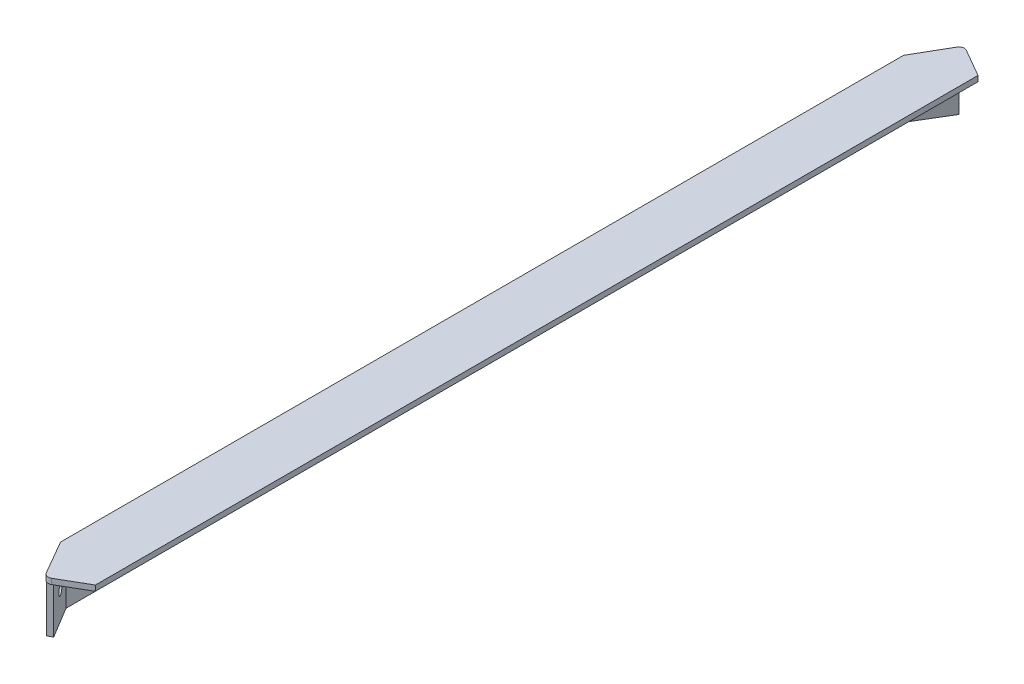
ISO-10303-21;
HEADER;
FILE_DESCRIPTION(('STEP AP214'),'2;1');
FILE_NAME('part.step','',(''),(''),'','','');
FILE_SCHEMA(('AUTOMOTIVE_DESIGN { 1 0 10303 214 1 1 1 1 }'));
ENDSEC;
DATA;
#1=APPLICATION_CONTEXT('core data for automotive mechanical design processes');
#2=APPLICATION_PROTOCOL_DEFINITION('international standard','automotive_design',2000,#1);
#3=PRODUCT_CONTEXT('',#1,'mechanical');
#4=PRODUCT('Part','Part','',(#3));
#5=PRODUCT_RELATED_PRODUCT_CATEGORY('part','',(#4));
#6=PRODUCT_DEFINITION_FORMATION('','',#4);
#7=PRODUCT_DEFINITION_CONTEXT('part definition',#1,'design');
#8=PRODUCT_DEFINITION('design','',#6,#7);
#9=PRODUCT_DEFINITION_SHAPE('','',#8);
#10=(LENGTH_UNIT() NAMED_UNIT(*) SI_UNIT(.MILLI.,.METRE.));
#11=(NAMED_UNIT(*) PLANE_ANGLE_UNIT() SI_UNIT($,.RADIAN.));
#12=(NAMED_UNIT(*) SI_UNIT($,.STERADIAN.) SOLID_ANGLE_UNIT());
#13=UNCERTAINTY_MEASURE_WITH_UNIT(LENGTH_MEASURE(1.E-05),#10,'distance_accuracy_value','');
#14=(GEOMETRIC_REPRESENTATION_CONTEXT(3) GLOBAL_UNCERTAINTY_ASSIGNED_CONTEXT((#13)) GLOBAL_UNIT_ASSIGNED_CONTEXT((#10,
#11,#12)) REPRESENTATION_CONTEXT('',''));
#15=CARTESIAN_POINT('',(0.,0.,0.));
#16=DIRECTION('',(0.,0.,1.));
#17=DIRECTION('',(1.,0.,0.));
#18=AXIS2_PLACEMENT_3D('',#15,#16,#17);
#19=CARTESIAN_POINT('',(7.,0.,540.));
#20=DIRECTION('',(0.,1.,0.));
#21=DIRECTION('',(-1.,0.,0.));
#22=AXIS2_PLACEMENT_3D('',#19,#20,#21);
#23=PLANE('',#22);
#24=DIRECTION('',(0.,0.,-1.));
#25=VECTOR('',#24,1.);
#26=CARTESIAN_POINT('',(0.,0.,540.));
#27=LINE('',#26,#25);
#28=CARTESIAN_POINT('',(0.,0.,540.));
#29=VERTEX_POINT('',#28);
#30=CARTESIAN_POINT('',(0.,0.,-540.));
#31=VERTEX_POINT('',#30);
#32=EDGE_CURVE('E305',#29,#31,#27,.T.);
#33=ORIENTED_EDGE('',*,*,#32,.T.);
#34=DIRECTION('',(0.499999999999995,0.,-0.866025403784441));
#35=VECTOR('',#34,1.);
#36=CARTESIAN_POINT('',(0.,0.,-540.));
#37=LINE('',#36,#35);
#38=CARTESIAN_POINT('',(24.9999999999997,0.,-583.301270189222));
#39=VERTEX_POINT('',#38);
#40=EDGE_CURVE('E165',#31,#39,#37,.T.);
#41=ORIENTED_EDGE('',*,*,#40,.T.);
#42=DIRECTION('',(0.866025403784432,0.,0.500000000000012));
#43=VECTOR('',#42,1.);
#44=CARTESIAN_POINT('',(24.9999999999997,0.,-583.301270189222));
#45=LINE('',#44,#43);
#46=CARTESIAN_POINT('',(31.0621778264905,0.,-579.801270189222));
#47=VERTEX_POINT('',#46);
#48=EDGE_CURVE('E209',#39,#47,#45,.T.);
#49=ORIENTED_EDGE('',*,*,#48,.T.);
#50=DIRECTION('',(-0.517360980401775,0.,0.855767267402601));
#51=VECTOR('',#50,1.);
#52=CARTESIAN_POINT('',(31.0621778264905,0.,-579.801270189222));
#53=LINE('',#52,#51);
#54=CARTESIAN_POINT('',(7.,0.,-540.));
#55=VERTEX_POINT('',#54);
#56=EDGE_CURVE('E205',#47,#55,#53,.T.);
#57=ORIENTED_EDGE('',*,*,#56,.T.);
#58=DIRECTION('',(0.,0.,-1.));
#59=VECTOR('',#58,1.);
#60=CARTESIAN_POINT('',(7.,0.,540.));
#61=LINE('',#60,#59);
#62=CARTESIAN_POINT('',(7.,0.,540.));
#63=VERTEX_POINT('',#62);
#64=EDGE_CURVE('E317',#63,#55,#61,.T.);
#65=ORIENTED_EDGE('',*,*,#64,.F.);
#66=DIRECTION('',(-0.517360980401775,0.,-0.855767267402601));
#67=VECTOR('',#66,1.);
#68=CARTESIAN_POINT('',(31.0621778264905,0.,579.801270189222));
#69=LINE('',#68,#67);
#70=CARTESIAN_POINT('',(31.0621778264905,0.,579.801270189222));
#71=VERTEX_POINT('',#70);
#72=EDGE_CURVE('E283',#71,#63,#69,.T.);
#73=ORIENTED_EDGE('',*,*,#72,.F.);
#74=DIRECTION('',(0.866025403784432,0.,-0.500000000000012));
#75=VECTOR('',#74,1.);
#76=CARTESIAN_POINT('',(24.9999999999997,0.,583.301270189222));
#77=LINE('',#76,#75);
#78=CARTESIAN_POINT('',(24.9999999999997,0.,583.301270189222));
#79=VERTEX_POINT('',#78);
#80=EDGE_CURVE('E286',#79,#71,#77,.T.);
#81=ORIENTED_EDGE('',*,*,#80,.F.);
#82=DIRECTION('',(0.499999999999995,0.,0.866025403784441));
#83=VECTOR('',#82,1.);
#84=CARTESIAN_POINT('',(0.,0.,540.));
#85=LINE('',#84,#83);
#86=EDGE_CURVE('E278',#29,#79,#85,.T.);
#87=ORIENTED_EDGE('',*,*,#86,.F.);
#88=EDGE_LOOP('',(#33,#41,#49,#57,#65,#73,#81,#87));
#89=FACE_BOUND('',#88,.T.);
#90=ADVANCED_FACE('F45',(#89),#23,.F.);
#91=CARTESIAN_POINT('',(6.99999999999999,63.,540.));
#92=DIRECTION('',(-1.,0.,0.));
#93=DIRECTION('',(0.,-1.,0.));
#94=AXIS2_PLACEMENT_3D('',#91,#92,#93);
#95=PLANE('',#94);
#96=ORIENTED_EDGE('',*,*,#64,.T.);
#97=DIRECTION('',(0.,1.,0.));
#98=VECTOR('',#97,1.);
#99=CARTESIAN_POINT('',(6.99999999999999,63.,-540.));
#100=LINE('',#99,#98);
#101=CARTESIAN_POINT('',(6.99999999999999,58.,-540.));
#102=VERTEX_POINT('',#101);
#103=EDGE_CURVE('E221',#55,#102,#100,.T.);
#104=ORIENTED_EDGE('',*,*,#103,.T.);
#105=DIRECTION('',(0.,0.,-1.));
#106=VECTOR('',#105,1.);
#107=CARTESIAN_POINT('',(6.99999999999999,58.,540.));
#108=LINE('',#107,#106);
#109=CARTESIAN_POINT('',(6.99999999999999,58.,540.));
#110=VERTEX_POINT('',#109);
#111=EDGE_CURVE('E55',#102,#110,#108,.F.);
#112=ORIENTED_EDGE('',*,*,#111,.T.);
#113=DIRECTION('',(0.,1.,0.));
#114=VECTOR('',#113,1.);
#115=CARTESIAN_POINT('',(6.99999999999999,63.,540.));
#116=LINE('',#115,#114);
#117=EDGE_CURVE('E299',#63,#110,#116,.T.);
#118=ORIENTED_EDGE('',*,*,#117,.F.);
#119=EDGE_LOOP('',(#96,#104,#112,#118));
#120=FACE_BOUND('',#119,.T.);
#121=ADVANCED_FACE('F355',(#120),#95,.F.);
#122=CARTESIAN_POINT('',(70.,63.,540.));
#123=DIRECTION('',(0.,1.,0.));
#124=DIRECTION('',(-1.,0.,0.));
#125=AXIS2_PLACEMENT_3D('',#122,#123,#124);
#126=PLANE('',#125);
#127=DIRECTION('',(0.866025403784432,0.,-0.500000000000012));
#128=VECTOR('',#127,1.);
#129=CARTESIAN_POINT('',(24.9999999999997,63.,583.301270189222));
#130=LINE('',#129,#128);
#131=CARTESIAN_POINT('',(24.9999999999996,63.,583.301270189222));
#132=VERTEX_POINT('',#131);
#133=CARTESIAN_POINT('',(35.3931854107217,63.,577.300761794604));
#134=VERTEX_POINT('',#133);
#135=EDGE_CURVE('E279',#132,#134,#130,.T.);
#136=ORIENTED_EDGE('',*,*,#135,.T.);
#137=DIRECTION('',(-0.517360980401775,0.,-0.8557672674026));
#138=VECTOR('',#137,1.);
#139=CARTESIAN_POINT('',(11.2788363370125,63.,537.413195097991));
#140=LINE('',#139,#138);
#141=CARTESIAN_POINT('',(12.,63.,538.606072567695));
#142=VERTEX_POINT('',#141);
#143=EDGE_CURVE('E323',#134,#142,#140,.T.);
#144=ORIENTED_EDGE('',*,*,#143,.T.);
#145=DIRECTION('',(0.,0.,-1.));
#146=VECTOR('',#145,1.);
#147=CARTESIAN_POINT('',(12.,63.,0.));
#148=LINE('',#147,#146);
#149=CARTESIAN_POINT('',(12.,63.,-538.606072567695));
#150=VERTEX_POINT('',#149);
#151=EDGE_CURVE('E320',#142,#150,#148,.T.);
#152=ORIENTED_EDGE('',*,*,#151,.T.);
#153=DIRECTION('',(-0.517360980401775,0.,0.8557672674026));
#154=VECTOR('',#153,1.);
#155=CARTESIAN_POINT('',(11.2788363370125,63.,-537.413195097991));
#156=LINE('',#155,#154);
#157=CARTESIAN_POINT('',(35.3931854107217,63.,-577.300761794604));
#158=VERTEX_POINT('',#157);
#159=EDGE_CURVE('E226',#158,#150,#156,.T.);
#160=ORIENTED_EDGE('',*,*,#159,.F.);
#161=DIRECTION('',(0.866025403784432,0.,0.500000000000012));
#162=VECTOR('',#161,1.);
#163=CARTESIAN_POINT('',(24.9999999999997,63.,-583.301270189222));
#164=LINE('',#163,#162);
#165=CARTESIAN_POINT('',(24.9999999999996,63.,-583.301270189222));
#166=VERTEX_POINT('',#165);
#167=EDGE_CURVE('E200',#166,#158,#164,.T.);
#168=ORIENTED_EDGE('',*,*,#167,.F.);
#169=CARTESIAN_POINT('',(31.0621778264907,63.,-579.801270189222));
#170=DIRECTION('',(0.,-1.,0.));
#171=DIRECTION('',(0.,0.,-1.));
#172=AXIS2_PLACEMENT_3D('',#169,#170,#171);
#173=CIRCLE('',#172,6.99999999999994);
#174=CARTESIAN_POINT('',(34.5621778264907,63.,-585.863448015713));
#175=VERTEX_POINT('',#174);
#176=EDGE_CURVE('E161',#166,#175,#173,.T.);
#177=ORIENTED_EDGE('',*,*,#176,.T.);
#178=DIRECTION('',(0.86602540378444,0.,0.499999999999998));
#179=VECTOR('',#178,1.);
#180=CARTESIAN_POINT('',(34.5621778264907,63.,-585.863448015713));
#181=LINE('',#180,#179);
#182=CARTESIAN_POINT('',(69.9999999999999,63.,-565.403411844343));
#183=VERTEX_POINT('',#182);
#184=EDGE_CURVE('E177',#175,#183,#181,.T.);
#185=ORIENTED_EDGE('',*,*,#184,.T.);
#186=DIRECTION('',(0.,0.,-1.));
#187=VECTOR('',#186,1.);
#188=CARTESIAN_POINT('',(70.,63.,540.));
#189=LINE('',#188,#187);
#190=CARTESIAN_POINT('',(69.9999999999999,63.,565.403411844343));
#191=VERTEX_POINT('',#190);
#192=EDGE_CURVE('E314',#191,#183,#189,.T.);
#193=ORIENTED_EDGE('',*,*,#192,.F.);
#194=DIRECTION('',(0.86602540378444,0.,-0.499999999999998));
#195=VECTOR('',#194,1.);
#196=CARTESIAN_POINT('',(34.5621778264907,63.,585.863448015713));
#197=LINE('',#196,#195);
#198=CARTESIAN_POINT('',(34.5621778264907,63.,585.863448015713));
#199=VERTEX_POINT('',#198);
#200=EDGE_CURVE('E254',#199,#191,#197,.T.);
#201=ORIENTED_EDGE('',*,*,#200,.F.);
#202=CARTESIAN_POINT('',(31.0621778264907,63.,579.801270189222));
#203=DIRECTION('',(0.,1.,0.));
#204=DIRECTION('',(0.,0.,1.));
#205=AXIS2_PLACEMENT_3D('',#202,#203,#204);
#206=CIRCLE('',#205,6.99999999999994);
#207=EDGE_CURVE('E249',#132,#199,#206,.T.);
#208=ORIENTED_EDGE('',*,*,#207,.F.);
#209=EDGE_LOOP('',(#136,#144,#152,#160,#168,#177,#185,#193,#201,#208));
#210=FACE_BOUND('',#209,.T.);
#211=ADVANCED_FACE('F341',(#210),#126,.F.);
#212=CARTESIAN_POINT('',(70.,70.,540.));
#213=DIRECTION('',(-1.,0.,0.));
#214=DIRECTION('',(0.,0.,1.));
#215=AXIS2_PLACEMENT_3D('',#212,#213,#214);
#216=PLANE('',#215);
#217=ORIENTED_EDGE('',*,*,#192,.T.);
#218=DIRECTION('',(0.,-1.,0.));
#219=VECTOR('',#218,1.);
#220=CARTESIAN_POINT('',(69.9999999999999,70.,-565.403411844343));
#221=LINE('',#220,#219);
#222=CARTESIAN_POINT('',(69.9999999999999,70.,-565.403411844343));
#223=VERTEX_POINT('',#222);
#224=EDGE_CURVE('E185',#223,#183,#221,.T.);
#225=ORIENTED_EDGE('',*,*,#224,.F.);
#226=DIRECTION('',(0.,0.,-1.));
#227=VECTOR('',#226,1.);
#228=CARTESIAN_POINT('',(70.,70.,540.));
#229=LINE('',#228,#227);
#230=CARTESIAN_POINT('',(69.9999999999999,70.,565.403411844343));
#231=VERTEX_POINT('',#230);
#232=EDGE_CURVE('E311',#231,#223,#229,.T.);
#233=ORIENTED_EDGE('',*,*,#232,.F.);
#234=DIRECTION('',(0.,-1.,0.));
#235=VECTOR('',#234,1.);
#236=CARTESIAN_POINT('',(69.9999999999999,70.,565.403411844343));
#237=LINE('',#236,#235);
#238=EDGE_CURVE('E261',#231,#191,#237,.T.);
#239=ORIENTED_EDGE('',*,*,#238,.T.);
#240=EDGE_LOOP('',(#217,#225,#233,#239));
#241=FACE_BOUND('',#240,.T.);
#242=ADVANCED_FACE('F387',(#241),#216,.F.);
#243=CARTESIAN_POINT('',(0.,70.,540.));
#244=DIRECTION('',(0.,-1.,0.));
#245=DIRECTION('',(0.,0.,-1.));
#246=AXIS2_PLACEMENT_3D('',#243,#244,#245);
#247=PLANE('',#246);
#248=ORIENTED_EDGE('',*,*,#232,.T.);
#249=DIRECTION('',(0.86602540378444,0.,0.499999999999998));
#250=VECTOR('',#249,1.);
#251=CARTESIAN_POINT('',(34.5621778264907,70.,-585.863448015713));
#252=LINE('',#251,#250);
#253=CARTESIAN_POINT('',(34.5621778264907,70.,-585.863448015713));
#254=VERTEX_POINT('',#253);
#255=EDGE_CURVE('E181',#254,#223,#252,.T.);
#256=ORIENTED_EDGE('',*,*,#255,.F.);
#257=CARTESIAN_POINT('',(31.0621778264907,70.,-579.801270189222));
#258=DIRECTION('',(0.,-1.,0.));
#259=DIRECTION('',(0.,0.,-1.));
#260=AXIS2_PLACEMENT_3D('',#257,#258,#259);
#261=CIRCLE('',#260,6.99999999999994);
#262=CARTESIAN_POINT('',(24.9999999999996,70.,-583.301270189222));
#263=VERTEX_POINT('',#262);
#264=EDGE_CURVE('E158',#263,#254,#261,.T.);
#265=ORIENTED_EDGE('',*,*,#264,.F.);
#266=DIRECTION('',(0.499999999999996,0.,-0.866025403784441));
#267=VECTOR('',#266,1.);
#268=CARTESIAN_POINT('',(0.,70.,-540.));
#269=LINE('',#268,#267);
#270=CARTESIAN_POINT('',(0.,70.,-540.));
#271=VERTEX_POINT('',#270);
#272=EDGE_CURVE('E170',#271,#263,#269,.T.);
#273=ORIENTED_EDGE('',*,*,#272,.F.);
#274=DIRECTION('',(0.,0.,-1.));
#275=VECTOR('',#274,1.);
#276=CARTESIAN_POINT('',(0.,70.,540.));
#277=LINE('',#276,#275);
#278=CARTESIAN_POINT('',(0.,70.,540.));
#279=VERTEX_POINT('',#278);
#280=EDGE_CURVE('E308',#279,#271,#277,.T.);
#281=ORIENTED_EDGE('',*,*,#280,.F.);
#282=DIRECTION('',(0.499999999999996,0.,0.866025403784441));
#283=VECTOR('',#282,1.);
#284=CARTESIAN_POINT('',(0.,70.,540.));
#285=LINE('',#284,#283);
#286=CARTESIAN_POINT('',(24.9999999999996,70.,583.301270189222));
#287=VERTEX_POINT('',#286);
#288=EDGE_CURVE('E250',#279,#287,#285,.T.);
#289=ORIENTED_EDGE('',*,*,#288,.T.);
#290=CARTESIAN_POINT('',(31.0621778264907,70.,579.801270189222));
#291=DIRECTION('',(0.,1.,0.));
#292=DIRECTION('',(0.,0.,1.));
#293=AXIS2_PLACEMENT_3D('',#290,#291,#292);
#294=CIRCLE('',#293,6.99999999999994);
#295=CARTESIAN_POINT('',(34.5621778264907,70.,585.863448015713));
#296=VERTEX_POINT('',#295);
#297=EDGE_CURVE('E253',#287,#296,#294,.T.);
#298=ORIENTED_EDGE('',*,*,#297,.T.);
#299=DIRECTION('',(0.86602540378444,0.,-0.499999999999998));
#300=VECTOR('',#299,1.);
#301=CARTESIAN_POINT('',(34.5621778264907,70.,585.863448015713));
#302=LINE('',#301,#300);
#303=EDGE_CURVE('E257',#296,#231,#302,.T.);
#304=ORIENTED_EDGE('',*,*,#303,.T.);
#305=EDGE_LOOP('',(#248,#256,#265,#273,#281,#289,#298,#304));
#306=FACE_BOUND('',#305,.T.);
#307=ADVANCED_FACE('F179',(#306),#247,.F.);
#308=CARTESIAN_POINT('',(0.,0.,540.));
#309=DIRECTION('',(1.,0.,0.));
#310=DIRECTION('',(0.,0.,-1.));
#311=AXIS2_PLACEMENT_3D('',#308,#309,#310);
#312=PLANE('',#311);
#313=ORIENTED_EDGE('',*,*,#280,.T.);
#314=DIRECTION('',(0.,-1.,0.));
#315=VECTOR('',#314,1.);
#316=CARTESIAN_POINT('',(0.,0.,-540.));
#317=LINE('',#316,#315);
#318=EDGE_CURVE('E174',#271,#31,#317,.T.);
#319=ORIENTED_EDGE('',*,*,#318,.T.);
#320=ORIENTED_EDGE('',*,*,#32,.F.);
#321=DIRECTION('',(0.,-1.,0.));
#322=VECTOR('',#321,1.);
#323=CARTESIAN_POINT('',(0.,0.,540.));
#324=LINE('',#323,#322);
#325=EDGE_CURVE('E302',#279,#29,#324,.T.);
#326=ORIENTED_EDGE('',*,*,#325,.F.);
#327=EDGE_LOOP('',(#313,#319,#320,#326));
#328=FACE_BOUND('',#327,.T.);
#329=ADVANCED_FACE('F369',(#328),#312,.F.);
#330=CARTESIAN_POINT('',(0.,63.,540.));
#331=DIRECTION('',(0.866025403784441,0.,-0.499999999999995));
#332=DIRECTION('',(-0.499999999999995,0.,-0.866025403784441));
#333=AXIS2_PLACEMENT_3D('',#330,#331,#332);
#334=PLANE('',#333);
#335=CARTESIAN_POINT('',(12.5680467926569,35.,561.768495596785));
#336=DIRECTION('',(0.866025403784441,0.,-0.499999999999995));
#337=DIRECTION('',(-0.499999999999995,0.,-0.866025403784441));
#338=AXIS2_PLACEMENT_3D('',#335,#336,#337);
#339=ELLIPSE('',#338,6.0012201470837,6.00000000000005);
#340=CARTESIAN_POINT('',(9.56743671911505,35.,556.571286495708));
#341=VERTEX_POINT('',#340);
#342=EDGE_CURVE('E245',#341,#341,#339,.T.);
#343=ORIENTED_EDGE('',*,*,#342,.T.);
#344=EDGE_LOOP('',(#343));
#345=FACE_BOUND('',#344,.T.);
#346=ORIENTED_EDGE('',*,*,#86,.T.);
#347=DIRECTION('',(0.,-1.,0.));
#348=VECTOR('',#347,1.);
#349=CARTESIAN_POINT('',(24.9999999999997,63.,583.301270189222));
#350=LINE('',#349,#348);
#351=EDGE_CURVE('E295',#132,#79,#350,.T.);
#352=ORIENTED_EDGE('',*,*,#351,.F.);
#353=DIRECTION('',(0.,-1.,0.));
#354=VECTOR('',#353,1.);
#355=CARTESIAN_POINT('',(24.9999999999996,70.,583.301270189222));
#356=LINE('',#355,#354);
#357=EDGE_CURVE('E274',#287,#132,#356,.T.);
#358=ORIENTED_EDGE('',*,*,#357,.F.);
#359=ORIENTED_EDGE('',*,*,#288,.F.);
#360=ORIENTED_EDGE('',*,*,#325,.T.);
#361=EDGE_LOOP('',(#346,#352,#358,#359,#360));
#362=FACE_BOUND('',#361,.T.);
#363=ADVANCED_FACE('F375',(#345,#362),#334,.F.);
#364=CARTESIAN_POINT('',(24.9999999999997,63.,583.301270189222));
#365=DIRECTION('',(-0.500000000000012,0.,-0.866025403784432));
#366=DIRECTION('',(-0.866025403784432,0.,0.500000000000012));
#367=AXIS2_PLACEMENT_3D('',#364,#365,#366);
#368=PLANE('',#367);
#369=ORIENTED_EDGE('',*,*,#80,.T.);
#370=DIRECTION('',(0.,-1.,0.));
#371=VECTOR('',#370,1.);
#372=CARTESIAN_POINT('',(31.0621778264905,63.,579.801270189222));
#373=LINE('',#372,#371);
#374=CARTESIAN_POINT('',(31.0621778264905,58.,579.801270189222));
#375=VERTEX_POINT('',#374);
#376=EDGE_CURVE('E282',#375,#71,#373,.T.);
#377=ORIENTED_EDGE('',*,*,#376,.F.);
#378=CARTESIAN_POINT('',(35.3931854107217,58.,577.300761794604));
#379=DIRECTION('',(-0.500000000000012,0.,-0.866025403784432));
#380=DIRECTION('',(0.866025403784432,0.,-0.500000000000012));
#381=AXIS2_PLACEMENT_3D('',#378,#379,#380);
#382=ELLIPSE('',#381,5.00101678923638,5.);
#383=EDGE_CURVE('E11',#375,#134,#382,.T.);
#384=ORIENTED_EDGE('',*,*,#383,.T.);
#385=ORIENTED_EDGE('',*,*,#135,.F.);
#386=ORIENTED_EDGE('',*,*,#351,.T.);
#387=EDGE_LOOP('',(#369,#377,#384,#385,#386));
#388=FACE_BOUND('',#387,.T.);
#389=ADVANCED_FACE('F346',(#388),#368,.F.);
#390=CARTESIAN_POINT('',(31.0621778264905,63.,579.801270189222));
#391=DIRECTION('',(-0.855767267402601,0.,0.517360980401775));
#392=DIRECTION('',(0.517360980401775,0.,0.8557672674026));
#393=AXIS2_PLACEMENT_3D('',#390,#391,#392);
#394=PLANE('',#393);
#395=CARTESIAN_POINT('',(18.1281533164403,35.,558.407088504161));
#396=DIRECTION('',(0.855767267402608,0.,-0.517360980401763));
#397=DIRECTION('',(-0.517360980401763,0.,-0.855767267402608));
#398=AXIS2_PLACEMENT_3D('',#395,#396,#397);
#399=CIRCLE('',#398,6.00000000000005);
#400=CARTESIAN_POINT('',(15.0239874340297,35.,553.272484899745));
#401=VERTEX_POINT('',#400);
#402=EDGE_CURVE('E241',#401,#401,#399,.T.);
#403=ORIENTED_EDGE('',*,*,#402,.F.);
#404=EDGE_LOOP('',(#403));
#405=FACE_BOUND('',#404,.T.);
#406=ORIENTED_EDGE('',*,*,#117,.T.);
#407=DIRECTION('',(-0.517360980401775,0.,-0.8557672674026));
#408=VECTOR('',#407,1.);
#409=CARTESIAN_POINT('',(31.0621778264905,58.,579.801270189222));
#410=LINE('',#409,#408);
#411=EDGE_CURVE('E62',#110,#375,#410,.F.);
#412=ORIENTED_EDGE('',*,*,#411,.T.);
#413=ORIENTED_EDGE('',*,*,#376,.T.);
#414=ORIENTED_EDGE('',*,*,#72,.T.);
#415=EDGE_LOOP('',(#406,#412,#413,#414));
#416=FACE_BOUND('',#415,.T.);
#417=ADVANCED_FACE('F349',(#405,#416),#394,.F.);
#418=CARTESIAN_POINT('',(31.0621778264907,70.,579.801270189222));
#419=DIRECTION('',(0.,-1.,0.));
#420=DIRECTION('',(0.,0.,-1.));
#421=AXIS2_PLACEMENT_3D('',#418,#419,#420);
#422=CYLINDRICAL_SURFACE('',#421,6.99999999999994);
#423=ORIENTED_EDGE('',*,*,#207,.T.);
#424=DIRECTION('',(0.,-1.,0.));
#425=VECTOR('',#424,1.);
#426=CARTESIAN_POINT('',(34.5621778264907,70.,585.863448015713));
#427=LINE('',#426,#425);
#428=EDGE_CURVE('E270',#296,#199,#427,.T.);
#429=ORIENTED_EDGE('',*,*,#428,.F.);
#430=ORIENTED_EDGE('',*,*,#297,.F.);
#431=ORIENTED_EDGE('',*,*,#357,.T.);
#432=EDGE_LOOP('',(#423,#429,#430,#431));
#433=FACE_BOUND('',#432,.T.);
#434=ADVANCED_FACE('F377',(#433),#422,.T.);
#435=CARTESIAN_POINT('',(34.5621778264907,70.,585.863448015713));
#436=DIRECTION('',(-0.499999999999998,0.,-0.86602540378444));
#437=DIRECTION('',(-0.86602540378444,0.,0.499999999999998));
#438=AXIS2_PLACEMENT_3D('',#435,#436,#437);
#439=PLANE('',#438);
#440=ORIENTED_EDGE('',*,*,#200,.T.);
#441=ORIENTED_EDGE('',*,*,#238,.F.);
#442=ORIENTED_EDGE('',*,*,#303,.F.);
#443=ORIENTED_EDGE('',*,*,#428,.T.);
#444=EDGE_LOOP('',(#440,#441,#442,#443));
#445=FACE_BOUND('',#444,.T.);
#446=ADVANCED_FACE('F381',(#445),#439,.F.);
#447=CARTESIAN_POINT('',(12.1377824446221,35.,562.028615366973));
#448=DIRECTION('',(0.855767267402608,0.,-0.517360980401763));
#449=DIRECTION('',(-0.517360980401763,0.,-0.855767267402608));
#450=AXIS2_PLACEMENT_3D('',#447,#448,#449);
#451=CYLINDRICAL_SURFACE('',#450,6.00000000000005);
#452=ORIENTED_EDGE('',*,*,#402,.T.);
#453=EDGE_LOOP('',(#452));
#454=FACE_BOUND('',#453,.T.);
#455=ORIENTED_EDGE('',*,*,#342,.F.);
#456=EDGE_LOOP('',(#455));
#457=FACE_BOUND('',#456,.T.);
#458=ADVANCED_FACE('F412',(#454,#457),#451,.F.);
#459=CARTESIAN_POINT('',(12.,58.,540.));
#460=DIRECTION('',(0.,0.,1.));
#461=DIRECTION('',(1.,0.,0.));
#462=AXIS2_PLACEMENT_3D('',#459,#460,#461);
#463=CYLINDRICAL_SURFACE('',#462,5.);
#464=ORIENTED_EDGE('',*,*,#111,.F.);
#465=CARTESIAN_POINT('',(12.,58.,-538.606072567695));
#466=DIRECTION('',(-0.268544905553428,0.,0.9632671663154));
#467=DIRECTION('',(0.9632671663154,0.,0.268544905553428));
#468=AXIS2_PLACEMENT_3D('',#465,#466,#467);
#469=ELLIPSE('',#468,5.19066794223407,5.);
#470=EDGE_CURVE('E236',#102,#150,#469,.F.);
#471=ORIENTED_EDGE('',*,*,#470,.T.);
#472=ORIENTED_EDGE('',*,*,#151,.F.);
#473=CARTESIAN_POINT('',(12.,58.,538.606072567695));
#474=DIRECTION('',(0.268544905553428,0.,0.9632671663154));
#475=DIRECTION('',(0.9632671663154,0.,-0.268544905553428));
#476=AXIS2_PLACEMENT_3D('',#473,#474,#475);
#477=ELLIPSE('',#476,5.19066794223407,5.);
#478=EDGE_CURVE('E49',#110,#142,#477,.F.);
#479=ORIENTED_EDGE('',*,*,#478,.F.);
#480=EDGE_LOOP('',(#464,#471,#472,#479));
#481=FACE_BOUND('',#480,.T.);
#482=ADVANCED_FACE('F47',(#481),#463,.F.);
#483=CARTESIAN_POINT('',(28.1415665316765,58.,565.305852422918));
#484=DIRECTION('',(0.517360980401775,0.,0.8557672674026));
#485=DIRECTION('',(0.855767267402601,0.,-0.517360980401775));
#486=AXIS2_PLACEMENT_3D('',#483,#484,#485);
#487=CYLINDRICAL_SURFACE('',#486,5.);
#488=ORIENTED_EDGE('',*,*,#383,.F.);
#489=ORIENTED_EDGE('',*,*,#411,.F.);
#490=ORIENTED_EDGE('',*,*,#478,.T.);
#491=ORIENTED_EDGE('',*,*,#143,.F.);
#492=EDGE_LOOP('',(#488,#489,#490,#491));
#493=FACE_BOUND('',#492,.T.);
#494=ADVANCED_FACE('F336',(#493),#487,.F.);
#495=CARTESIAN_POINT('',(0.,63.,-540.));
#496=DIRECTION('',(0.866025403784441,0.,0.499999999999995));
#497=DIRECTION('',(-0.499999999999995,0.,0.866025403784441));
#498=AXIS2_PLACEMENT_3D('',#495,#496,#497);
#499=PLANE('',#498);
#500=CARTESIAN_POINT('',(12.5680467926569,35.,-561.768495596785));
#501=DIRECTION('',(-0.866025403784441,0.,-0.499999999999995));
#502=DIRECTION('',(-0.499999999999995,0.,0.866025403784441));
#503=AXIS2_PLACEMENT_3D('',#500,#501,#502);
#504=ELLIPSE('',#503,6.0012201470837,6.00000000000005);
#505=CARTESIAN_POINT('',(9.56743671911505,35.,-556.571286495708));
#506=VERTEX_POINT('',#505);
#507=EDGE_CURVE('E191',#506,#506,#504,.T.);
#508=ORIENTED_EDGE('',*,*,#507,.F.);
#509=EDGE_LOOP('',(#508));
#510=FACE_BOUND('',#509,.T.);
#511=ORIENTED_EDGE('',*,*,#40,.F.);
#512=ORIENTED_EDGE('',*,*,#318,.F.);
#513=ORIENTED_EDGE('',*,*,#272,.T.);
#514=DIRECTION('',(0.,-1.,0.));
#515=VECTOR('',#514,1.);
#516=CARTESIAN_POINT('',(24.9999999999996,70.,-583.301270189222));
#517=LINE('',#516,#515);
#518=EDGE_CURVE('E154',#263,#166,#517,.T.);
#519=ORIENTED_EDGE('',*,*,#518,.T.);
#520=DIRECTION('',(0.,-1.,0.));
#521=VECTOR('',#520,1.);
#522=CARTESIAN_POINT('',(24.9999999999997,63.,-583.301270189222));
#523=LINE('',#522,#521);
#524=EDGE_CURVE('E218',#166,#39,#523,.T.);
#525=ORIENTED_EDGE('',*,*,#524,.T.);
#526=EDGE_LOOP('',(#511,#512,#513,#519,#525));
#527=FACE_BOUND('',#526,.T.);
#528=ADVANCED_FACE('F172',(#510,#527),#499,.F.);
#529=CARTESIAN_POINT('',(24.9999999999997,63.,-583.301270189222));
#530=DIRECTION('',(-0.500000000000012,0.,0.866025403784432));
#531=DIRECTION('',(-0.866025403784432,0.,-0.500000000000012));
#532=AXIS2_PLACEMENT_3D('',#529,#530,#531);
#533=PLANE('',#532);
#534=ORIENTED_EDGE('',*,*,#48,.F.);
#535=ORIENTED_EDGE('',*,*,#524,.F.);
#536=ORIENTED_EDGE('',*,*,#167,.T.);
#537=CARTESIAN_POINT('',(35.3931854107217,58.,-577.300761794604));
#538=DIRECTION('',(0.500000000000012,0.,-0.866025403784432));
#539=DIRECTION('',(0.866025403784432,0.,0.500000000000012));
#540=AXIS2_PLACEMENT_3D('',#537,#538,#539);
#541=ELLIPSE('',#540,5.00101678923638,5.);
#542=CARTESIAN_POINT('',(31.0621778264905,58.,-579.801270189222));
#543=VERTEX_POINT('',#542);
#544=EDGE_CURVE('E233',#543,#158,#541,.T.);
#545=ORIENTED_EDGE('',*,*,#544,.F.);
#546=DIRECTION('',(0.,-1.,0.));
#547=VECTOR('',#546,1.);
#548=CARTESIAN_POINT('',(31.0621778264905,63.,-579.801270189222));
#549=LINE('',#548,#547);
#550=EDGE_CURVE('E204',#543,#47,#549,.T.);
#551=ORIENTED_EDGE('',*,*,#550,.T.);
#552=EDGE_LOOP('',(#534,#535,#536,#545,#551));
#553=FACE_BOUND('',#552,.T.);
#554=ADVANCED_FACE('F365',(#553),#533,.F.);
#555=CARTESIAN_POINT('',(31.0621778264905,63.,-579.801270189222));
#556=DIRECTION('',(-0.855767267402601,0.,-0.517360980401775));
#557=DIRECTION('',(0.517360980401775,0.,-0.8557672674026));
#558=AXIS2_PLACEMENT_3D('',#555,#556,#557);
#559=PLANE('',#558);
#560=CARTESIAN_POINT('',(18.1281533164403,35.,-558.407088504161));
#561=DIRECTION('',(-0.855767267402608,0.,-0.517360980401763));
#562=DIRECTION('',(-0.517360980401763,0.,0.855767267402608));
#563=AXIS2_PLACEMENT_3D('',#560,#561,#562);
#564=CIRCLE('',#563,6.00000000000005);
#565=CARTESIAN_POINT('',(15.0239874340297,35.,-553.272484899745));
#566=VERTEX_POINT('',#565);
#567=EDGE_CURVE('E240',#566,#566,#564,.T.);
#568=ORIENTED_EDGE('',*,*,#567,.T.);
#569=EDGE_LOOP('',(#568));
#570=FACE_BOUND('',#569,.T.);
#571=ORIENTED_EDGE('',*,*,#103,.F.);
#572=ORIENTED_EDGE('',*,*,#56,.F.);
#573=ORIENTED_EDGE('',*,*,#550,.F.);
#574=DIRECTION('',(-0.517360980401775,0.,0.8557672674026));
#575=VECTOR('',#574,1.);
#576=CARTESIAN_POINT('',(31.0621778264905,58.,-579.801270189222));
#577=LINE('',#576,#575);
#578=EDGE_CURVE('E230',#102,#543,#577,.F.);
#579=ORIENTED_EDGE('',*,*,#578,.F.);
#580=EDGE_LOOP('',(#571,#572,#573,#579));
#581=FACE_BOUND('',#580,.T.);
#582=ADVANCED_FACE('F358',(#570,#581),#559,.F.);
#583=CARTESIAN_POINT('',(31.0621778264907,70.,-579.801270189222));
#584=DIRECTION('',(0.,-1.,0.));
#585=DIRECTION('',(0.,0.,1.));
#586=AXIS2_PLACEMENT_3D('',#583,#584,#585);
#587=CYLINDRICAL_SURFACE('',#586,6.99999999999994);
#588=ORIENTED_EDGE('',*,*,#176,.F.);
#589=ORIENTED_EDGE('',*,*,#518,.F.);
#590=ORIENTED_EDGE('',*,*,#264,.T.);
#591=DIRECTION('',(0.,-1.,0.));
#592=VECTOR('',#591,1.);
#593=CARTESIAN_POINT('',(34.5621778264907,70.,-585.863448015713));
#594=LINE('',#593,#592);
#595=EDGE_CURVE('E166',#254,#175,#594,.T.);
#596=ORIENTED_EDGE('',*,*,#595,.T.);
#597=EDGE_LOOP('',(#588,#589,#590,#596));
#598=FACE_BOUND('',#597,.T.);
#599=ADVANCED_FACE('F156',(#598),#587,.T.);
#600=CARTESIAN_POINT('',(34.5621778264907,70.,-585.863448015713));
#601=DIRECTION('',(-0.499999999999998,0.,0.86602540378444));
#602=DIRECTION('',(-0.86602540378444,0.,-0.499999999999998));
#603=AXIS2_PLACEMENT_3D('',#600,#601,#602);
#604=PLANE('',#603);
#605=ORIENTED_EDGE('',*,*,#184,.F.);
#606=ORIENTED_EDGE('',*,*,#595,.F.);
#607=ORIENTED_EDGE('',*,*,#255,.T.);
#608=ORIENTED_EDGE('',*,*,#224,.T.);
#609=EDGE_LOOP('',(#605,#606,#607,#608));
#610=FACE_BOUND('',#609,.T.);
#611=ADVANCED_FACE('F386',(#610),#604,.F.);
#612=CARTESIAN_POINT('',(12.1377824446221,35.,-562.028615366973));
#613=DIRECTION('',(0.855767267402608,0.,0.517360980401763));
#614=DIRECTION('',(-0.517360980401763,0.,0.855767267402608));
#615=AXIS2_PLACEMENT_3D('',#612,#613,#614);
#616=CYLINDRICAL_SURFACE('',#615,6.00000000000005);
#617=ORIENTED_EDGE('',*,*,#567,.F.);
#618=EDGE_LOOP('',(#617));
#619=FACE_BOUND('',#618,.T.);
#620=ORIENTED_EDGE('',*,*,#507,.T.);
#621=EDGE_LOOP('',(#620));
#622=FACE_BOUND('',#621,.T.);
#623=ADVANCED_FACE('F591',(#619,#622),#616,.F.);
#624=CARTESIAN_POINT('',(28.1415665316765,58.,-565.305852422918));
#625=DIRECTION('',(0.517360980401775,0.,-0.8557672674026));
#626=DIRECTION('',(0.855767267402601,0.,0.517360980401775));
#627=AXIS2_PLACEMENT_3D('',#624,#625,#626);
#628=CYLINDRICAL_SURFACE('',#627,5.);
#629=ORIENTED_EDGE('',*,*,#544,.T.);
#630=ORIENTED_EDGE('',*,*,#159,.T.);
#631=ORIENTED_EDGE('',*,*,#470,.F.);
#632=ORIENTED_EDGE('',*,*,#578,.T.);
#633=EDGE_LOOP('',(#629,#630,#631,#632));
#634=FACE_BOUND('',#633,.T.);
#635=ADVANCED_FACE('F362',(#634),#628,.F.);
#636=CLOSED_SHELL('',(#90,#121,#211,#242,#307,#329,#363,#389,#417,#434,#446,#458,#482,#494,#528,
#554,#582,#599,#611,#623,#635));
#637=MANIFOLD_SOLID_BREP('B2',#636);
#638=ADVANCED_BREP_SHAPE_REPRESENTATION('',(#18,#637),#14);
#639=SHAPE_DEFINITION_REPRESENTATION(#9,#638);
ENDSEC;
END-ISO-10303-21;
